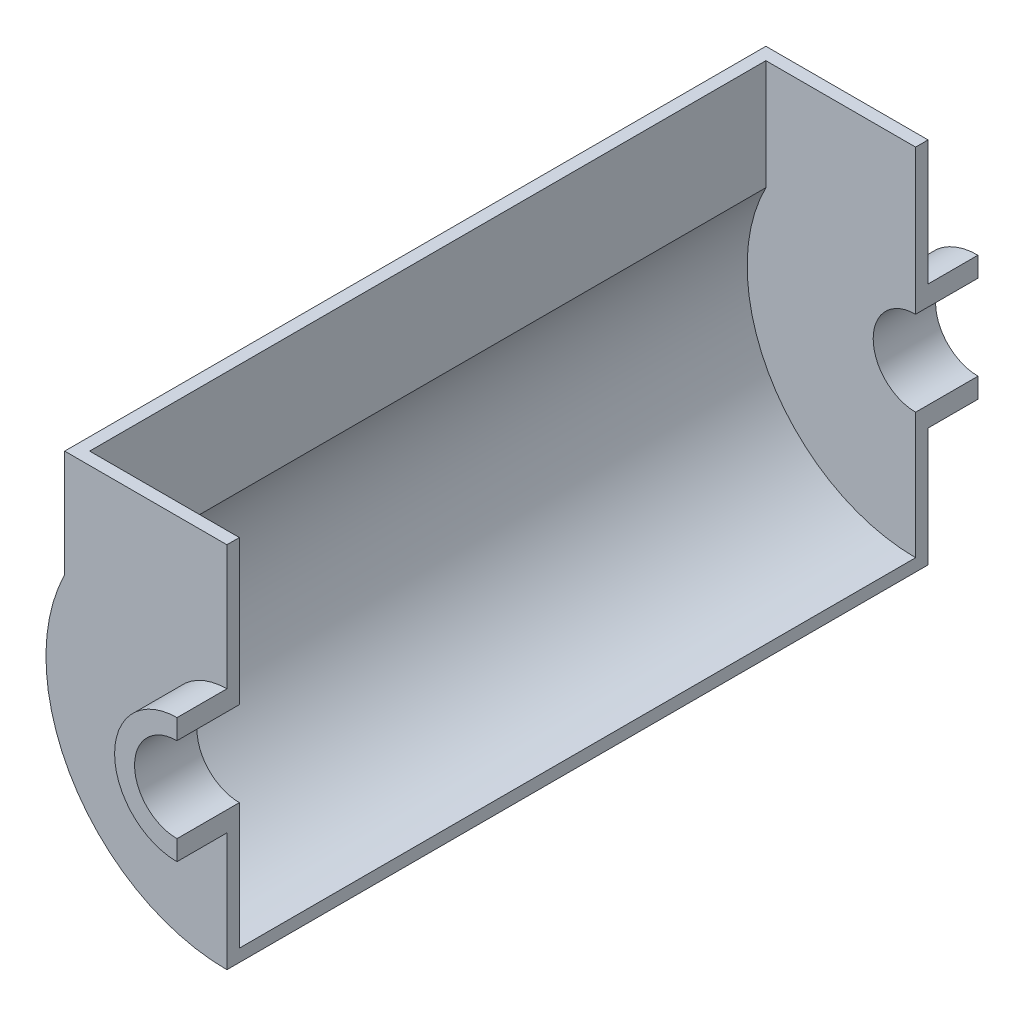
ISO-10303-21;
HEADER;
FILE_DESCRIPTION(('STEP AP214'),'2;1');
FILE_NAME('part.step','',(''),(''),'','','');
FILE_SCHEMA(('AUTOMOTIVE_DESIGN { 1 0 10303 214 1 1 1 1 }'));
ENDSEC;
DATA;
#1=APPLICATION_CONTEXT('core data for automotive mechanical design processes');
#2=APPLICATION_PROTOCOL_DEFINITION('international standard','automotive_design',2000,#1);
#3=PRODUCT_CONTEXT('',#1,'mechanical');
#4=PRODUCT('Part','Part','',(#3));
#5=PRODUCT_RELATED_PRODUCT_CATEGORY('part','',(#4));
#6=PRODUCT_DEFINITION_FORMATION('','',#4);
#7=PRODUCT_DEFINITION_CONTEXT('part definition',#1,'design');
#8=PRODUCT_DEFINITION('design','',#6,#7);
#9=PRODUCT_DEFINITION_SHAPE('','',#8);
#10=(LENGTH_UNIT() NAMED_UNIT(*) SI_UNIT(.MILLI.,.METRE.));
#11=(NAMED_UNIT(*) PLANE_ANGLE_UNIT() SI_UNIT($,.RADIAN.));
#12=(NAMED_UNIT(*) SI_UNIT($,.STERADIAN.) SOLID_ANGLE_UNIT());
#13=UNCERTAINTY_MEASURE_WITH_UNIT(LENGTH_MEASURE(1.E-05),#10,'distance_accuracy_value','');
#14=(GEOMETRIC_REPRESENTATION_CONTEXT(3) GLOBAL_UNCERTAINTY_ASSIGNED_CONTEXT((#13)) GLOBAL_UNIT_ASSIGNED_CONTEXT((#10,
#11,#12)) REPRESENTATION_CONTEXT('',''));
#15=CARTESIAN_POINT('',(0.,0.,0.));
#16=DIRECTION('',(0.,0.,1.));
#17=DIRECTION('',(1.,0.,0.));
#18=AXIS2_PLACEMENT_3D('',#15,#16,#17);
#19=CARTESIAN_POINT('',(0.,0.,-5.));
#20=DIRECTION('',(0.,0.,1.));
#21=DIRECTION('',(1.,0.,0.));
#22=AXIS2_PLACEMENT_3D('',#19,#20,#21);
#23=CYLINDRICAL_SURFACE('',#22,17.);
#24=DIRECTION('',(0.,0.,1.));
#25=VECTOR('',#24,1.);
#26=CARTESIAN_POINT('',(0.,17.,-5.));
#27=LINE('',#26,#25);
#28=CARTESIAN_POINT('',(0.,17.,-5.));
#29=VERTEX_POINT('',#28);
#30=CARTESIAN_POINT('',(0.,17.,20.));
#31=VERTEX_POINT('',#30);
#32=EDGE_CURVE('E37',#29,#31,#27,.T.);
#33=ORIENTED_EDGE('',*,*,#32,.T.);
#34=CARTESIAN_POINT('',(0.,0.,20.));
#35=DIRECTION('',(0.,0.,-1.));
#36=DIRECTION('',(1.,0.,0.));
#37=AXIS2_PLACEMENT_3D('',#34,#35,#36);
#38=CIRCLE('',#37,17.);
#39=CARTESIAN_POINT('',(0.,-17.,20.));
#40=VERTEX_POINT('',#39);
#41=EDGE_CURVE('E227',#40,#31,#38,.T.);
#42=ORIENTED_EDGE('',*,*,#41,.F.);
#43=DIRECTION('',(0.,0.,1.));
#44=VECTOR('',#43,1.);
#45=CARTESIAN_POINT('',(0.,-17.,-5.));
#46=LINE('',#45,#44);
#47=CARTESIAN_POINT('',(0.,-17.,-5.));
#48=VERTEX_POINT('',#47);
#49=EDGE_CURVE('E11',#48,#40,#46,.T.);
#50=ORIENTED_EDGE('',*,*,#49,.F.);
#51=CARTESIAN_POINT('',(0.,0.,-5.));
#52=DIRECTION('',(0.,0.,-1.));
#53=DIRECTION('',(1.,0.,0.));
#54=AXIS2_PLACEMENT_3D('',#51,#52,#53);
#55=CIRCLE('',#54,17.);
#56=EDGE_CURVE('E244',#48,#29,#55,.T.);
#57=ORIENTED_EDGE('',*,*,#56,.T.);
#58=EDGE_LOOP('',(#33,#42,#50,#57));
#59=FACE_BOUND('',#58,.T.);
#60=ADVANCED_FACE('F34',(#59),#23,.F.);
#61=CARTESIAN_POINT('',(0.,-17.,-5.));
#62=DIRECTION('',(1.,0.,0.));
#63=DIRECTION('',(0.,0.,-1.));
#64=AXIS2_PLACEMENT_3D('',#61,#62,#63);
#65=PLANE('',#64);
#66=ORIENTED_EDGE('',*,*,#49,.T.);
#67=DIRECTION('',(0.,1.,0.));
#68=VECTOR('',#67,1.);
#69=CARTESIAN_POINT('',(0.,-17.,20.));
#70=LINE('',#69,#68);
#71=CARTESIAN_POINT('',(0.,-25.,20.));
#72=VERTEX_POINT('',#71);
#73=EDGE_CURVE('E241',#72,#40,#70,.T.);
#74=ORIENTED_EDGE('',*,*,#73,.F.);
#75=DIRECTION('',(0.,0.,1.));
#76=VECTOR('',#75,1.);
#77=CARTESIAN_POINT('',(0.,-25.,-5.));
#78=LINE('',#77,#76);
#79=CARTESIAN_POINT('',(0.,-25.,0.));
#80=VERTEX_POINT('',#79);
#81=EDGE_CURVE('E42',#80,#72,#78,.T.);
#82=ORIENTED_EDGE('',*,*,#81,.F.);
#83=DIRECTION('',(0.,1.,0.));
#84=VECTOR('',#83,1.);
#85=CARTESIAN_POINT('',(0.,-25.,0.));
#86=LINE('',#85,#84);
#87=CARTESIAN_POINT('',(0.,-72.5,0.));
#88=VERTEX_POINT('',#87);
#89=EDGE_CURVE('E209',#88,#80,#86,.T.);
#90=ORIENTED_EDGE('',*,*,#89,.F.);
#91=DIRECTION('',(0.,0.,1.));
#92=VECTOR('',#91,1.);
#93=CARTESIAN_POINT('',(0.,-72.5,-5.));
#94=LINE('',#93,#92);
#95=CARTESIAN_POINT('',(0.,-72.5,-281.));
#96=VERTEX_POINT('',#95);
#97=EDGE_CURVE('E225',#96,#88,#94,.T.);
#98=ORIENTED_EDGE('',*,*,#97,.F.);
#99=DIRECTION('',(0.,1.,0.));
#100=VECTOR('',#99,1.);
#101=CARTESIAN_POINT('',(0.,-25.,-281.));
#102=LINE('',#101,#100);
#103=CARTESIAN_POINT('',(0.,-25.,-281.));
#104=VERTEX_POINT('',#103);
#105=EDGE_CURVE('E158',#96,#104,#102,.T.);
#106=ORIENTED_EDGE('',*,*,#105,.T.);
#107=DIRECTION('',(0.,0.,-1.));
#108=VECTOR('',#107,1.);
#109=CARTESIAN_POINT('',(0.,-25.,-276.));
#110=LINE('',#109,#108);
#111=CARTESIAN_POINT('',(0.,-25.,-301.));
#112=VERTEX_POINT('',#111);
#113=EDGE_CURVE('E185',#104,#112,#110,.T.);
#114=ORIENTED_EDGE('',*,*,#113,.T.);
#115=DIRECTION('',(0.,1.,0.));
#116=VECTOR('',#115,1.);
#117=CARTESIAN_POINT('',(0.,-17.,-301.));
#118=LINE('',#117,#116);
#119=CARTESIAN_POINT('',(0.,-17.,-301.));
#120=VERTEX_POINT('',#119);
#121=EDGE_CURVE('E177',#112,#120,#118,.T.);
#122=ORIENTED_EDGE('',*,*,#121,.T.);
#123=DIRECTION('',(0.,0.,-1.));
#124=VECTOR('',#123,1.);
#125=CARTESIAN_POINT('',(0.,-17.,-276.));
#126=LINE('',#125,#124);
#127=CARTESIAN_POINT('',(0.,-17.,-276.));
#128=VERTEX_POINT('',#127);
#129=EDGE_CURVE('E181',#128,#120,#126,.T.);
#130=ORIENTED_EDGE('',*,*,#129,.F.);
#131=DIRECTION('',(0.,1.,0.));
#132=VECTOR('',#131,1.);
#133=CARTESIAN_POINT('',(0.,-17.,-276.));
#134=LINE('',#133,#132);
#135=CARTESIAN_POINT('',(0.,-67.5,-276.));
#136=VERTEX_POINT('',#135);
#137=EDGE_CURVE('E173',#136,#128,#134,.T.);
#138=ORIENTED_EDGE('',*,*,#137,.F.);
#139=DIRECTION('',(0.,0.,1.));
#140=VECTOR('',#139,1.);
#141=CARTESIAN_POINT('',(0.,-67.5,-440.354799138936));
#142=LINE('',#141,#140);
#143=CARTESIAN_POINT('',(0.,-67.5,-5.));
#144=VERTEX_POINT('',#143);
#145=EDGE_CURVE('E202',#136,#144,#142,.T.);
#146=ORIENTED_EDGE('',*,*,#145,.T.);
#147=DIRECTION('',(0.,1.,0.));
#148=VECTOR('',#147,1.);
#149=CARTESIAN_POINT('',(0.,-17.,-5.));
#150=LINE('',#149,#148);
#151=EDGE_CURVE('E249',#144,#48,#150,.T.);
#152=ORIENTED_EDGE('',*,*,#151,.T.);
#153=EDGE_LOOP('',(#66,#74,#82,#90,#98,#106,#114,#122,#130,#138,#146,#152));
#154=FACE_BOUND('',#153,.T.);
#155=ADVANCED_FACE('F266',(#154),#65,.T.);
#156=CARTESIAN_POINT('',(0.,0.,-5.));
#157=DIRECTION('',(0.,0.,1.));
#158=DIRECTION('',(1.,0.,0.));
#159=AXIS2_PLACEMENT_3D('',#156,#157,#158);
#160=CYLINDRICAL_SURFACE('',#159,25.);
#161=CARTESIAN_POINT('',(0.,0.,0.));
#162=DIRECTION('',(0.,0.,-1.));
#163=DIRECTION('',(1.,0.,0.));
#164=AXIS2_PLACEMENT_3D('',#161,#162,#163);
#165=CIRCLE('',#164,25.);
#166=CARTESIAN_POINT('',(0.,25.,0.));
#167=VERTEX_POINT('',#166);
#168=EDGE_CURVE('E58',#80,#167,#165,.T.);
#169=ORIENTED_EDGE('',*,*,#168,.F.);
#170=ORIENTED_EDGE('',*,*,#81,.T.);
#171=CARTESIAN_POINT('',(0.,0.,20.));
#172=DIRECTION('',(0.,0.,1.));
#173=DIRECTION('',(1.,0.,0.));
#174=AXIS2_PLACEMENT_3D('',#171,#172,#173);
#175=CIRCLE('',#174,25.);
#176=CARTESIAN_POINT('',(0.,25.,20.));
#177=VERTEX_POINT('',#176);
#178=EDGE_CURVE('E238',#177,#72,#175,.T.);
#179=ORIENTED_EDGE('',*,*,#178,.F.);
#180=DIRECTION('',(0.,0.,1.));
#181=VECTOR('',#180,1.);
#182=CARTESIAN_POINT('',(0.,25.,-5.));
#183=LINE('',#182,#181);
#184=EDGE_CURVE('E251',#167,#177,#183,.T.);
#185=ORIENTED_EDGE('',*,*,#184,.F.);
#186=EDGE_LOOP('',(#169,#170,#179,#185));
#187=FACE_BOUND('',#186,.T.);
#188=ADVANCED_FACE('F330',(#187),#160,.T.);
#189=CARTESIAN_POINT('',(0.,25.,-5.));
#190=DIRECTION('',(1.,0.,0.));
#191=DIRECTION('',(0.,0.,-1.));
#192=AXIS2_PLACEMENT_3D('',#189,#190,#191);
#193=PLANE('',#192);
#194=DIRECTION('',(0.,1.,0.));
#195=VECTOR('',#194,1.);
#196=CARTESIAN_POINT('',(0.,25.,-5.));
#197=LINE('',#196,#195);
#198=CARTESIAN_POINT('',(0.,75.,-5.));
#199=VERTEX_POINT('',#198);
#200=EDGE_CURVE('E247',#29,#199,#197,.T.);
#201=ORIENTED_EDGE('',*,*,#200,.T.);
#202=DIRECTION('',(0.,0.,1.));
#203=VECTOR('',#202,1.);
#204=CARTESIAN_POINT('',(0.,75.,-5.));
#205=LINE('',#204,#203);
#206=CARTESIAN_POINT('',(0.,75.,0.));
#207=VERTEX_POINT('',#206);
#208=EDGE_CURVE('E208',#199,#207,#205,.T.);
#209=ORIENTED_EDGE('',*,*,#208,.T.);
#210=DIRECTION('',(0.,1.,0.));
#211=VECTOR('',#210,1.);
#212=CARTESIAN_POINT('',(0.,25.,0.));
#213=LINE('',#212,#211);
#214=EDGE_CURVE('E211',#167,#207,#213,.T.);
#215=ORIENTED_EDGE('',*,*,#214,.F.);
#216=ORIENTED_EDGE('',*,*,#184,.T.);
#217=DIRECTION('',(0.,1.,0.));
#218=VECTOR('',#217,1.);
#219=CARTESIAN_POINT('',(0.,25.,20.));
#220=LINE('',#219,#218);
#221=EDGE_CURVE('E235',#31,#177,#220,.T.);
#222=ORIENTED_EDGE('',*,*,#221,.F.);
#223=ORIENTED_EDGE('',*,*,#32,.F.);
#224=EDGE_LOOP('',(#201,#209,#215,#216,#222,#223));
#225=FACE_BOUND('',#224,.T.);
#226=ADVANCED_FACE('F260',(#225),#193,.T.);
#227=CARTESIAN_POINT('',(0.,0.,-5.));
#228=DIRECTION('',(0.,0.,1.));
#229=DIRECTION('',(1.,0.,0.));
#230=AXIS2_PLACEMENT_3D('',#227,#228,#229);
#231=PLANE('',#230);
#232=ORIENTED_EDGE('',*,*,#151,.F.);
#233=CARTESIAN_POINT('',(0.,0.,-5.));
#234=DIRECTION('',(0.,0.,-1.));
#235=DIRECTION('',(-1.,0.,0.));
#236=AXIS2_PLACEMENT_3D('',#233,#234,#235);
#237=CIRCLE('',#236,67.5);
#238=CARTESIAN_POINT('',(-60.,30.9232921921325,-5.));
#239=VERTEX_POINT('',#238);
#240=EDGE_CURVE('E184',#144,#239,#237,.T.);
#241=ORIENTED_EDGE('',*,*,#240,.T.);
#242=DIRECTION('',(0.,1.,0.));
#243=VECTOR('',#242,1.);
#244=CARTESIAN_POINT('',(-60.,0.,-5.));
#245=LINE('',#244,#243);
#246=CARTESIAN_POINT('',(-60.,75.,-5.));
#247=VERTEX_POINT('',#246);
#248=EDGE_CURVE('E192',#239,#247,#245,.T.);
#249=ORIENTED_EDGE('',*,*,#248,.T.);
#250=DIRECTION('',(-1.,0.,0.));
#251=VECTOR('',#250,1.);
#252=CARTESIAN_POINT('',(0.,75.,-5.));
#253=LINE('',#252,#251);
#254=EDGE_CURVE('E206',#199,#247,#253,.T.);
#255=ORIENTED_EDGE('',*,*,#254,.F.);
#256=ORIENTED_EDGE('',*,*,#200,.F.);
#257=ORIENTED_EDGE('',*,*,#56,.F.);
#258=EDGE_LOOP('',(#232,#241,#249,#255,#256,#257));
#259=FACE_BOUND('',#258,.T.);
#260=ADVANCED_FACE('F270',(#259),#231,.F.);
#261=CARTESIAN_POINT('',(0.,0.,20.));
#262=DIRECTION('',(0.,0.,1.));
#263=DIRECTION('',(1.,0.,0.));
#264=AXIS2_PLACEMENT_3D('',#261,#262,#263);
#265=PLANE('',#264);
#266=ORIENTED_EDGE('',*,*,#41,.T.);
#267=ORIENTED_EDGE('',*,*,#221,.T.);
#268=ORIENTED_EDGE('',*,*,#178,.T.);
#269=ORIENTED_EDGE('',*,*,#73,.T.);
#270=EDGE_LOOP('',(#266,#267,#268,#269));
#271=FACE_BOUND('',#270,.T.);
#272=ADVANCED_FACE('F263',(#271),#265,.T.);
#273=CARTESIAN_POINT('',(0.,0.,-5.));
#274=DIRECTION('',(0.,0.,1.));
#275=DIRECTION('',(1.,0.,0.));
#276=AXIS2_PLACEMENT_3D('',#273,#274,#275);
#277=CYLINDRICAL_SURFACE('',#276,72.5);
#278=CARTESIAN_POINT('',(0.,0.,0.));
#279=DIRECTION('',(0.,0.,1.));
#280=DIRECTION('',(1.,0.,0.));
#281=AXIS2_PLACEMENT_3D('',#278,#279,#280);
#282=CIRCLE('',#281,72.5);
#283=CARTESIAN_POINT('',(-65.,32.1130814466629,0.));
#284=VERTEX_POINT('',#283);
#285=EDGE_CURVE('E220',#284,#88,#282,.T.);
#286=ORIENTED_EDGE('',*,*,#285,.F.);
#287=DIRECTION('',(0.,0.,1.));
#288=VECTOR('',#287,1.);
#289=CARTESIAN_POINT('',(-65.,32.1130814466629,-5.));
#290=LINE('',#289,#288);
#291=CARTESIAN_POINT('',(-65.,32.1130814466629,-281.));
#292=VERTEX_POINT('',#291);
#293=EDGE_CURVE('E228',#292,#284,#290,.T.);
#294=ORIENTED_EDGE('',*,*,#293,.F.);
#295=CARTESIAN_POINT('',(0.,0.,-281.));
#296=DIRECTION('',(0.,0.,1.));
#297=DIRECTION('',(1.,0.,0.));
#298=AXIS2_PLACEMENT_3D('',#295,#296,#297);
#299=CIRCLE('',#298,72.5);
#300=EDGE_CURVE('E282',#292,#96,#299,.T.);
#301=ORIENTED_EDGE('',*,*,#300,.T.);
#302=ORIENTED_EDGE('',*,*,#97,.T.);
#303=EDGE_LOOP('',(#286,#294,#301,#302));
#304=FACE_BOUND('',#303,.T.);
#305=ADVANCED_FACE('F283',(#304),#277,.T.);
#306=CARTESIAN_POINT('',(-65.,75.,-5.));
#307=DIRECTION('',(-1.,0.,0.));
#308=DIRECTION('',(0.,-1.,0.));
#309=AXIS2_PLACEMENT_3D('',#306,#307,#308);
#310=PLANE('',#309);
#311=DIRECTION('',(0.,-1.,0.));
#312=VECTOR('',#311,1.);
#313=CARTESIAN_POINT('',(-65.,75.,0.));
#314=LINE('',#313,#312);
#315=CARTESIAN_POINT('',(-65.,75.,0.));
#316=VERTEX_POINT('',#315);
#317=EDGE_CURVE('E217',#316,#284,#314,.T.);
#318=ORIENTED_EDGE('',*,*,#317,.F.);
#319=DIRECTION('',(0.,0.,1.));
#320=VECTOR('',#319,1.);
#321=CARTESIAN_POINT('',(-65.,75.,-5.));
#322=LINE('',#321,#320);
#323=CARTESIAN_POINT('',(-65.,75.,-281.));
#324=VERTEX_POINT('',#323);
#325=EDGE_CURVE('E230',#324,#316,#322,.T.);
#326=ORIENTED_EDGE('',*,*,#325,.F.);
#327=DIRECTION('',(0.,-1.,0.));
#328=VECTOR('',#327,1.);
#329=CARTESIAN_POINT('',(-65.,75.,-281.));
#330=LINE('',#329,#328);
#331=EDGE_CURVE('E287',#324,#292,#330,.T.);
#332=ORIENTED_EDGE('',*,*,#331,.T.);
#333=ORIENTED_EDGE('',*,*,#293,.T.);
#334=EDGE_LOOP('',(#318,#326,#332,#333));
#335=FACE_BOUND('',#334,.T.);
#336=ADVANCED_FACE('F317',(#335),#310,.T.);
#337=CARTESIAN_POINT('',(0.,75.,-5.));
#338=DIRECTION('',(0.,1.,0.));
#339=DIRECTION('',(-1.,0.,0.));
#340=AXIS2_PLACEMENT_3D('',#337,#338,#339);
#341=PLANE('',#340);
#342=DIRECTION('',(-1.,0.,0.));
#343=VECTOR('',#342,1.);
#344=CARTESIAN_POINT('',(0.,75.,0.));
#345=LINE('',#344,#343);
#346=EDGE_CURVE('E214',#207,#316,#345,.T.);
#347=ORIENTED_EDGE('',*,*,#346,.F.);
#348=ORIENTED_EDGE('',*,*,#208,.F.);
#349=ORIENTED_EDGE('',*,*,#254,.T.);
#350=DIRECTION('',(0.,0.,1.));
#351=VECTOR('',#350,1.);
#352=CARTESIAN_POINT('',(-60.,75.,-440.354799138936));
#353=LINE('',#352,#351);
#354=CARTESIAN_POINT('',(-60.,75.,-276.));
#355=VERTEX_POINT('',#354);
#356=EDGE_CURVE('E50',#355,#247,#353,.T.);
#357=ORIENTED_EDGE('',*,*,#356,.F.);
#358=DIRECTION('',(-1.,0.,0.));
#359=VECTOR('',#358,1.);
#360=CARTESIAN_POINT('',(0.,75.,-276.));
#361=LINE('',#360,#359);
#362=CARTESIAN_POINT('',(0.,75.,-276.));
#363=VERTEX_POINT('',#362);
#364=EDGE_CURVE('E148',#363,#355,#361,.T.);
#365=ORIENTED_EDGE('',*,*,#364,.F.);
#366=DIRECTION('',(0.,0.,-1.));
#367=VECTOR('',#366,1.);
#368=CARTESIAN_POINT('',(0.,75.,-276.));
#369=LINE('',#368,#367);
#370=CARTESIAN_POINT('',(0.,75.,-281.));
#371=VERTEX_POINT('',#370);
#372=EDGE_CURVE('E153',#363,#371,#369,.T.);
#373=ORIENTED_EDGE('',*,*,#372,.T.);
#374=DIRECTION('',(-1.,0.,0.));
#375=VECTOR('',#374,1.);
#376=CARTESIAN_POINT('',(0.,75.,-281.));
#377=LINE('',#376,#375);
#378=EDGE_CURVE('E313',#371,#324,#377,.T.);
#379=ORIENTED_EDGE('',*,*,#378,.T.);
#380=ORIENTED_EDGE('',*,*,#325,.T.);
#381=EDGE_LOOP('',(#347,#348,#349,#357,#365,#373,#379,#380));
#382=FACE_BOUND('',#381,.T.);
#383=ADVANCED_FACE('F151',(#382),#341,.T.);
#384=CARTESIAN_POINT('',(0.,0.,0.));
#385=DIRECTION('',(0.,0.,1.));
#386=DIRECTION('',(1.,0.,0.));
#387=AXIS2_PLACEMENT_3D('',#384,#385,#386);
#388=PLANE('',#387);
#389=ORIENTED_EDGE('',*,*,#168,.T.);
#390=ORIENTED_EDGE('',*,*,#214,.T.);
#391=ORIENTED_EDGE('',*,*,#346,.T.);
#392=ORIENTED_EDGE('',*,*,#317,.T.);
#393=ORIENTED_EDGE('',*,*,#285,.T.);
#394=ORIENTED_EDGE('',*,*,#89,.T.);
#395=EDGE_LOOP('',(#389,#390,#391,#392,#393,#394));
#396=FACE_BOUND('',#395,.T.);
#397=ADVANCED_FACE('F275',(#396),#388,.T.);
#398=CARTESIAN_POINT('',(-60.,0.,-440.354799138936));
#399=DIRECTION('',(1.,0.,0.));
#400=DIRECTION('',(0.,0.,-1.));
#401=AXIS2_PLACEMENT_3D('',#398,#399,#400);
#402=PLANE('',#401);
#403=DIRECTION('',(0.,0.,1.));
#404=VECTOR('',#403,1.);
#405=CARTESIAN_POINT('',(-60.,30.9232921921325,-440.354799138936));
#406=LINE('',#405,#404);
#407=CARTESIAN_POINT('',(-60.,30.9232921921325,-276.));
#408=VERTEX_POINT('',#407);
#409=EDGE_CURVE('E201',#408,#239,#406,.T.);
#410=ORIENTED_EDGE('',*,*,#409,.F.);
#411=DIRECTION('',(0.,1.,0.));
#412=VECTOR('',#411,1.);
#413=CARTESIAN_POINT('',(-60.,0.,-276.));
#414=LINE('',#413,#412);
#415=EDGE_CURVE('E194',#408,#355,#414,.T.);
#416=ORIENTED_EDGE('',*,*,#415,.T.);
#417=ORIENTED_EDGE('',*,*,#356,.T.);
#418=ORIENTED_EDGE('',*,*,#248,.F.);
#419=EDGE_LOOP('',(#410,#416,#417,#418));
#420=FACE_BOUND('',#419,.T.);
#421=ADVANCED_FACE('F374',(#420),#402,.T.);
#422=CARTESIAN_POINT('',(0.,0.,-440.354799138936));
#423=DIRECTION('',(0.,0.,1.));
#424=DIRECTION('',(1.,0.,0.));
#425=AXIS2_PLACEMENT_3D('',#422,#423,#424);
#426=CYLINDRICAL_SURFACE('',#425,67.5);
#427=ORIENTED_EDGE('',*,*,#145,.F.);
#428=CARTESIAN_POINT('',(0.,0.,-276.));
#429=DIRECTION('',(0.,0.,-1.));
#430=DIRECTION('',(-1.,0.,0.));
#431=AXIS2_PLACEMENT_3D('',#428,#429,#430);
#432=CIRCLE('',#431,67.5);
#433=EDGE_CURVE('E198',#136,#408,#432,.T.);
#434=ORIENTED_EDGE('',*,*,#433,.T.);
#435=ORIENTED_EDGE('',*,*,#409,.T.);
#436=ORIENTED_EDGE('',*,*,#240,.F.);
#437=EDGE_LOOP('',(#427,#434,#435,#436));
#438=FACE_BOUND('',#437,.T.);
#439=ADVANCED_FACE('F378',(#438),#426,.F.);
#440=CARTESIAN_POINT('',(0.,0.,-276.));
#441=DIRECTION('',(0.,0.,-1.));
#442=DIRECTION('',(1.,0.,0.));
#443=AXIS2_PLACEMENT_3D('',#440,#441,#442);
#444=CYLINDRICAL_SURFACE('',#443,17.);
#445=DIRECTION('',(0.,0.,-1.));
#446=VECTOR('',#445,1.);
#447=CARTESIAN_POINT('',(0.,17.,-276.));
#448=LINE('',#447,#446);
#449=CARTESIAN_POINT('',(0.,17.,-276.));
#450=VERTEX_POINT('',#449);
#451=CARTESIAN_POINT('',(0.,17.,-301.));
#452=VERTEX_POINT('',#451);
#453=EDGE_CURVE('E175',#450,#452,#448,.T.);
#454=ORIENTED_EDGE('',*,*,#453,.F.);
#455=CARTESIAN_POINT('',(0.,0.,-276.));
#456=DIRECTION('',(0.,0.,-1.));
#457=DIRECTION('',(1.,0.,0.));
#458=AXIS2_PLACEMENT_3D('',#455,#456,#457);
#459=CIRCLE('',#458,17.);
#460=EDGE_CURVE('E171',#128,#450,#459,.T.);
#461=ORIENTED_EDGE('',*,*,#460,.F.);
#462=ORIENTED_EDGE('',*,*,#129,.T.);
#463=CARTESIAN_POINT('',(0.,0.,-301.));
#464=DIRECTION('',(0.,0.,-1.));
#465=DIRECTION('',(1.,0.,0.));
#466=AXIS2_PLACEMENT_3D('',#463,#464,#465);
#467=CIRCLE('',#466,17.);
#468=EDGE_CURVE('E167',#120,#452,#467,.T.);
#469=ORIENTED_EDGE('',*,*,#468,.T.);
#470=EDGE_LOOP('',(#454,#461,#462,#469));
#471=FACE_BOUND('',#470,.T.);
#472=ADVANCED_FACE('F309',(#471),#444,.F.);
#473=CARTESIAN_POINT('',(0.,0.,-276.));
#474=DIRECTION('',(0.,0.,-1.));
#475=DIRECTION('',(1.,0.,0.));
#476=AXIS2_PLACEMENT_3D('',#473,#474,#475);
#477=CYLINDRICAL_SURFACE('',#476,25.);
#478=CARTESIAN_POINT('',(0.,0.,-281.));
#479=DIRECTION('',(0.,0.,-1.));
#480=DIRECTION('',(1.,0.,0.));
#481=AXIS2_PLACEMENT_3D('',#478,#479,#480);
#482=CIRCLE('',#481,25.);
#483=CARTESIAN_POINT('',(0.,25.,-281.));
#484=VERTEX_POINT('',#483);
#485=EDGE_CURVE('E291',#104,#484,#482,.T.);
#486=ORIENTED_EDGE('',*,*,#485,.T.);
#487=DIRECTION('',(0.,0.,-1.));
#488=VECTOR('',#487,1.);
#489=CARTESIAN_POINT('',(0.,25.,-276.));
#490=LINE('',#489,#488);
#491=CARTESIAN_POINT('',(0.,25.,-301.));
#492=VERTEX_POINT('',#491);
#493=EDGE_CURVE('E188',#484,#492,#490,.T.);
#494=ORIENTED_EDGE('',*,*,#493,.T.);
#495=CARTESIAN_POINT('',(0.,0.,-301.));
#496=DIRECTION('',(0.,0.,1.));
#497=DIRECTION('',(1.,0.,0.));
#498=AXIS2_PLACEMENT_3D('',#495,#496,#497);
#499=CIRCLE('',#498,25.);
#500=EDGE_CURVE('E300',#492,#112,#499,.T.);
#501=ORIENTED_EDGE('',*,*,#500,.T.);
#502=ORIENTED_EDGE('',*,*,#113,.F.);
#503=EDGE_LOOP('',(#486,#494,#501,#502));
#504=FACE_BOUND('',#503,.T.);
#505=ADVANCED_FACE('F311',(#504),#477,.T.);
#506=CARTESIAN_POINT('',(0.,25.,-276.));
#507=DIRECTION('',(1.,0.,0.));
#508=DIRECTION('',(0.,0.,1.));
#509=AXIS2_PLACEMENT_3D('',#506,#507,#508);
#510=PLANE('',#509);
#511=DIRECTION('',(0.,1.,0.));
#512=VECTOR('',#511,1.);
#513=CARTESIAN_POINT('',(0.,25.,-276.));
#514=LINE('',#513,#512);
#515=EDGE_CURVE('E163',#450,#363,#514,.T.);
#516=ORIENTED_EDGE('',*,*,#515,.F.);
#517=ORIENTED_EDGE('',*,*,#453,.T.);
#518=DIRECTION('',(0.,1.,0.));
#519=VECTOR('',#518,1.);
#520=CARTESIAN_POINT('',(0.,25.,-301.));
#521=LINE('',#520,#519);
#522=EDGE_CURVE('E298',#452,#492,#521,.T.);
#523=ORIENTED_EDGE('',*,*,#522,.T.);
#524=ORIENTED_EDGE('',*,*,#493,.F.);
#525=DIRECTION('',(0.,1.,0.));
#526=VECTOR('',#525,1.);
#527=CARTESIAN_POINT('',(0.,25.,-281.));
#528=LINE('',#527,#526);
#529=EDGE_CURVE('E166',#484,#371,#528,.T.);
#530=ORIENTED_EDGE('',*,*,#529,.T.);
#531=ORIENTED_EDGE('',*,*,#372,.F.);
#532=EDGE_LOOP('',(#516,#517,#523,#524,#530,#531));
#533=FACE_BOUND('',#532,.T.);
#534=ADVANCED_FACE('F161',(#533),#510,.T.);
#535=CARTESIAN_POINT('',(0.,0.,-276.));
#536=DIRECTION('',(0.,0.,-1.));
#537=DIRECTION('',(1.,0.,0.));
#538=AXIS2_PLACEMENT_3D('',#535,#536,#537);
#539=PLANE('',#538);
#540=ORIENTED_EDGE('',*,*,#433,.F.);
#541=ORIENTED_EDGE('',*,*,#137,.T.);
#542=ORIENTED_EDGE('',*,*,#460,.T.);
#543=ORIENTED_EDGE('',*,*,#515,.T.);
#544=ORIENTED_EDGE('',*,*,#364,.T.);
#545=ORIENTED_EDGE('',*,*,#415,.F.);
#546=EDGE_LOOP('',(#540,#541,#542,#543,#544,#545));
#547=FACE_BOUND('',#546,.T.);
#548=ADVANCED_FACE('F169',(#547),#539,.F.);
#549=CARTESIAN_POINT('',(0.,0.,-301.));
#550=DIRECTION('',(0.,0.,-1.));
#551=DIRECTION('',(1.,0.,0.));
#552=AXIS2_PLACEMENT_3D('',#549,#550,#551);
#553=PLANE('',#552);
#554=ORIENTED_EDGE('',*,*,#468,.F.);
#555=ORIENTED_EDGE('',*,*,#121,.F.);
#556=ORIENTED_EDGE('',*,*,#500,.F.);
#557=ORIENTED_EDGE('',*,*,#522,.F.);
#558=EDGE_LOOP('',(#554,#555,#556,#557));
#559=FACE_BOUND('',#558,.T.);
#560=ADVANCED_FACE('F307',(#559),#553,.T.);
#561=CARTESIAN_POINT('',(0.,0.,-281.));
#562=DIRECTION('',(0.,0.,-1.));
#563=DIRECTION('',(1.,0.,0.));
#564=AXIS2_PLACEMENT_3D('',#561,#562,#563);
#565=PLANE('',#564);
#566=ORIENTED_EDGE('',*,*,#485,.F.);
#567=ORIENTED_EDGE('',*,*,#105,.F.);
#568=ORIENTED_EDGE('',*,*,#300,.F.);
#569=ORIENTED_EDGE('',*,*,#331,.F.);
#570=ORIENTED_EDGE('',*,*,#378,.F.);
#571=ORIENTED_EDGE('',*,*,#529,.F.);
#572=EDGE_LOOP('',(#566,#567,#568,#569,#570,#571));
#573=FACE_BOUND('',#572,.T.);
#574=ADVANCED_FACE('F289',(#573),#565,.T.);
#575=CLOSED_SHELL('',(#60,#155,#188,#226,#260,#272,#305,#336,#383,#397,#421,#439,#472,#505,#534,
#548,#560,#574));
#576=MANIFOLD_SOLID_BREP('B2',#575);
#577=ADVANCED_BREP_SHAPE_REPRESENTATION('',(#18,#576),#14);
#578=SHAPE_DEFINITION_REPRESENTATION(#9,#577);
ENDSEC;
END-ISO-10303-21;
